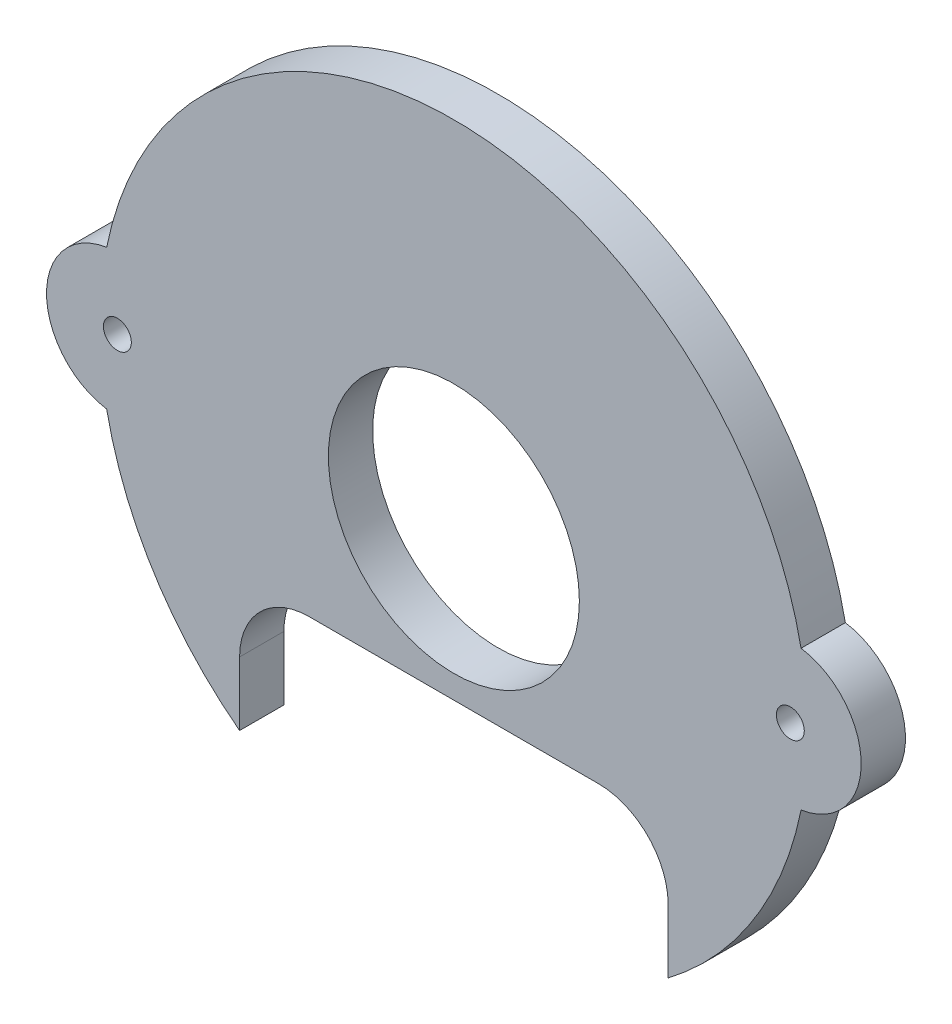
ISO-10303-21;
HEADER;
FILE_DESCRIPTION(('STEP AP214'),'2;1');
FILE_NAME('part.step','',(''),(''),'','','');
FILE_SCHEMA(('AUTOMOTIVE_DESIGN { 1 0 10303 214 1 1 1 1 }'));
ENDSEC;
DATA;
#1=APPLICATION_CONTEXT('core data for automotive mechanical design processes');
#2=APPLICATION_PROTOCOL_DEFINITION('international standard','automotive_design',2000,#1);
#3=PRODUCT_CONTEXT('',#1,'mechanical');
#4=PRODUCT('Part','Part','',(#3));
#5=PRODUCT_RELATED_PRODUCT_CATEGORY('part','',(#4));
#6=PRODUCT_DEFINITION_FORMATION('','',#4);
#7=PRODUCT_DEFINITION_CONTEXT('part definition',#1,'design');
#8=PRODUCT_DEFINITION('design','',#6,#7);
#9=PRODUCT_DEFINITION_SHAPE('','',#8);
#10=(LENGTH_UNIT() NAMED_UNIT(*) SI_UNIT(.MILLI.,.METRE.));
#11=(NAMED_UNIT(*) PLANE_ANGLE_UNIT() SI_UNIT($,.RADIAN.));
#12=(NAMED_UNIT(*) SI_UNIT($,.STERADIAN.) SOLID_ANGLE_UNIT());
#13=UNCERTAINTY_MEASURE_WITH_UNIT(LENGTH_MEASURE(1.E-05),#10,'distance_accuracy_value','');
#14=(GEOMETRIC_REPRESENTATION_CONTEXT(3) GLOBAL_UNCERTAINTY_ASSIGNED_CONTEXT((#13)) GLOBAL_UNIT_ASSIGNED_CONTEXT((#10,
#11,#12)) REPRESENTATION_CONTEXT('',''));
#15=CARTESIAN_POINT('',(0.,0.,0.));
#16=DIRECTION('',(0.,0.,1.));
#17=DIRECTION('',(1.,0.,0.));
#18=AXIS2_PLACEMENT_3D('',#15,#16,#17);
#19=CARTESIAN_POINT('',(12.065,0.,3.175));
#20=DIRECTION('',(0.,0.,1.));
#21=DIRECTION('',(1.,0.,0.));
#22=AXIS2_PLACEMENT_3D('',#19,#20,#21);
#23=PLANE('',#22);
#24=CARTESIAN_POINT('',(24.13,0.,3.175));
#25=DIRECTION('',(0.,0.,1.));
#26=DIRECTION('',(1.,0.,0.));
#27=AXIS2_PLACEMENT_3D('',#24,#25,#26);
#28=CIRCLE('',#27,1.);
#29=CARTESIAN_POINT('',(25.13,0.,3.175));
#30=VERTEX_POINT('',#29);
#31=EDGE_CURVE('E214',#30,#30,#28,.T.);
#32=ORIENTED_EDGE('',*,*,#31,.F.);
#33=EDGE_LOOP('',(#32));
#34=FACE_BOUND('',#33,.T.);
#35=CARTESIAN_POINT('',(-24.13,0.,3.175));
#36=DIRECTION('',(0.,0.,1.));
#37=DIRECTION('',(1.,0.,0.));
#38=AXIS2_PLACEMENT_3D('',#35,#36,#37);
#39=CIRCLE('',#38,1.);
#40=CARTESIAN_POINT('',(-23.13,0.,3.175));
#41=VERTEX_POINT('',#40);
#42=EDGE_CURVE('E143',#41,#41,#39,.T.);
#43=ORIENTED_EDGE('',*,*,#42,.F.);
#44=EDGE_LOOP('',(#43));
#45=FACE_BOUND('',#44,.T.);
#46=CARTESIAN_POINT('',(0.,0.,3.175));
#47=DIRECTION('',(0.,0.,1.));
#48=DIRECTION('',(1.,0.,0.));
#49=AXIS2_PLACEMENT_3D('',#46,#47,#48);
#50=CIRCLE('',#49,9.);
#51=CARTESIAN_POINT('',(9.,0.,3.175));
#52=VERTEX_POINT('',#51);
#53=EDGE_CURVE('E220',#52,#52,#50,.T.);
#54=ORIENTED_EDGE('',*,*,#53,.F.);
#55=EDGE_LOOP('',(#54));
#56=FACE_BOUND('',#55,.T.);
#57=DIRECTION('',(0.,1.,0.));
#58=VECTOR('',#57,1.);
#59=CARTESIAN_POINT('',(-15.367,0.,3.175));
#60=LINE('',#59,#58);
#61=CARTESIAN_POINT('',(-15.367,-20.2241269527265,3.175));
#62=VERTEX_POINT('',#61);
#63=CARTESIAN_POINT('',(-15.367,-15.6545488428575,3.175));
#64=VERTEX_POINT('',#63);
#65=EDGE_CURVE('E238',#62,#64,#60,.T.);
#66=ORIENTED_EDGE('',*,*,#65,.T.);
#67=CARTESIAN_POINT('',(-10.367,-15.6545488428575,3.175));
#68=DIRECTION('',(0.,0.,1.));
#69=DIRECTION('',(1.,0.,0.));
#70=AXIS2_PLACEMENT_3D('',#67,#68,#69);
#71=CIRCLE('',#70,5.);
#72=CARTESIAN_POINT('',(-10.367,-10.6545488428575,3.175));
#73=VERTEX_POINT('',#72);
#74=EDGE_CURVE('E11',#64,#73,#71,.F.);
#75=ORIENTED_EDGE('',*,*,#74,.T.);
#76=DIRECTION('',(1.,0.,0.));
#77=VECTOR('',#76,1.);
#78=CARTESIAN_POINT('',(12.065,-10.6545488428575,3.175));
#79=LINE('',#78,#77);
#80=CARTESIAN_POINT('',(10.367,-10.6545488428575,3.175));
#81=VERTEX_POINT('',#80);
#82=EDGE_CURVE('E228',#73,#81,#79,.T.);
#83=ORIENTED_EDGE('',*,*,#82,.T.);
#84=CARTESIAN_POINT('',(10.367,-15.6545488428575,3.175));
#85=DIRECTION('',(0.,0.,1.));
#86=DIRECTION('',(1.,0.,0.));
#87=AXIS2_PLACEMENT_3D('',#84,#85,#86);
#88=CIRCLE('',#87,5.);
#89=CARTESIAN_POINT('',(15.367,-15.6545488428575,3.175));
#90=VERTEX_POINT('',#89);
#91=EDGE_CURVE('E195',#81,#90,#88,.F.);
#92=ORIENTED_EDGE('',*,*,#91,.T.);
#93=DIRECTION('',(0.,-1.,0.));
#94=VECTOR('',#93,1.);
#95=CARTESIAN_POINT('',(15.367,0.,3.175));
#96=LINE('',#95,#94);
#97=CARTESIAN_POINT('',(15.367,-20.2241269527265,3.175));
#98=VERTEX_POINT('',#97);
#99=EDGE_CURVE('E235',#90,#98,#96,.T.);
#100=ORIENTED_EDGE('',*,*,#99,.T.);
#101=CARTESIAN_POINT('',(0.,0.,3.175));
#102=DIRECTION('',(0.,0.,1.));
#103=DIRECTION('',(1.,0.,0.));
#104=AXIS2_PLACEMENT_3D('',#101,#102,#103);
#105=CIRCLE('',#104,25.4);
#106=CARTESIAN_POINT('',(24.8986842105263,-5.02150620675586,3.175));
#107=VERTEX_POINT('',#106);
#108=EDGE_CURVE('E133',#98,#107,#105,.T.);
#109=ORIENTED_EDGE('',*,*,#108,.T.);
#110=CARTESIAN_POINT('',(24.13,0.,3.175));
#111=DIRECTION('',(0.,0.,1.));
#112=DIRECTION('',(1.,0.,0.));
#113=AXIS2_PLACEMENT_3D('',#110,#111,#112);
#114=CIRCLE('',#113,5.08000000000002);
#115=CARTESIAN_POINT('',(24.8986842105263,5.02150620675588,3.175));
#116=VERTEX_POINT('',#115);
#117=EDGE_CURVE('E202',#107,#116,#114,.T.);
#118=ORIENTED_EDGE('',*,*,#117,.T.);
#119=CARTESIAN_POINT('',(0.,0.,3.175));
#120=DIRECTION('',(0.,0.,1.));
#121=DIRECTION('',(1.,0.,0.));
#122=AXIS2_PLACEMENT_3D('',#119,#120,#121);
#123=CIRCLE('',#122,25.4);
#124=CARTESIAN_POINT('',(-24.8986842105263,5.02150620675583,3.175));
#125=VERTEX_POINT('',#124);
#126=EDGE_CURVE('E200',#116,#125,#123,.T.);
#127=ORIENTED_EDGE('',*,*,#126,.T.);
#128=CARTESIAN_POINT('',(-24.13,0.,3.175));
#129=DIRECTION('',(0.,0.,1.));
#130=DIRECTION('',(1.,0.,0.));
#131=AXIS2_PLACEMENT_3D('',#128,#129,#130);
#132=CIRCLE('',#131,5.08);
#133=CARTESIAN_POINT('',(-24.8986842105263,-5.02150620675586,3.175));
#134=VERTEX_POINT('',#133);
#135=EDGE_CURVE('E153',#125,#134,#132,.T.);
#136=ORIENTED_EDGE('',*,*,#135,.T.);
#137=EDGE_CURVE('E204',#134,#62,#105,.T.);
#138=ORIENTED_EDGE('',*,*,#137,.T.);
#139=EDGE_LOOP('',(#66,#75,#83,#92,#100,#109,#118,#127,#136,#138));
#140=FACE_BOUND('',#139,.T.);
#141=ADVANCED_FACE('F39',(#34,#45,#56,#140),#23,.T.);
#142=CARTESIAN_POINT('',(12.065,0.,0.));
#143=DIRECTION('',(0.,0.,1.));
#144=DIRECTION('',(1.,0.,0.));
#145=AXIS2_PLACEMENT_3D('',#142,#143,#144);
#146=PLANE('',#145);
#147=CARTESIAN_POINT('',(0.,0.,0.));
#148=DIRECTION('',(0.,0.,1.));
#149=DIRECTION('',(1.,0.,0.));
#150=AXIS2_PLACEMENT_3D('',#147,#148,#149);
#151=CIRCLE('',#150,9.);
#152=CARTESIAN_POINT('',(9.,0.,0.));
#153=VERTEX_POINT('',#152);
#154=EDGE_CURVE('E224',#153,#153,#151,.T.);
#155=ORIENTED_EDGE('',*,*,#154,.T.);
#156=EDGE_LOOP('',(#155));
#157=FACE_BOUND('',#156,.T.);
#158=CARTESIAN_POINT('',(24.13,0.,0.));
#159=DIRECTION('',(0.,0.,1.));
#160=DIRECTION('',(1.,0.,0.));
#161=AXIS2_PLACEMENT_3D('',#158,#159,#160);
#162=CIRCLE('',#161,1.);
#163=CARTESIAN_POINT('',(25.13,0.,0.));
#164=VERTEX_POINT('',#163);
#165=EDGE_CURVE('E216',#164,#164,#162,.T.);
#166=ORIENTED_EDGE('',*,*,#165,.T.);
#167=EDGE_LOOP('',(#166));
#168=FACE_BOUND('',#167,.T.);
#169=CARTESIAN_POINT('',(-24.13,0.,0.));
#170=DIRECTION('',(0.,0.,1.));
#171=DIRECTION('',(1.,0.,0.));
#172=AXIS2_PLACEMENT_3D('',#169,#170,#171);
#173=CIRCLE('',#172,1.);
#174=CARTESIAN_POINT('',(-23.13,0.,0.));
#175=VERTEX_POINT('',#174);
#176=EDGE_CURVE('E149',#175,#175,#173,.T.);
#177=ORIENTED_EDGE('',*,*,#176,.T.);
#178=EDGE_LOOP('',(#177));
#179=FACE_BOUND('',#178,.T.);
#180=DIRECTION('',(0.,1.,0.));
#181=VECTOR('',#180,1.);
#182=CARTESIAN_POINT('',(15.367,-10.6545488428575,0.));
#183=LINE('',#182,#181);
#184=CARTESIAN_POINT('',(15.367,-20.2241269527265,0.));
#185=VERTEX_POINT('',#184);
#186=CARTESIAN_POINT('',(15.367,-15.6545488428575,0.));
#187=VERTEX_POINT('',#186);
#188=EDGE_CURVE('E116',#185,#187,#183,.T.);
#189=ORIENTED_EDGE('',*,*,#188,.T.);
#190=CARTESIAN_POINT('',(10.367,-15.6545488428575,0.));
#191=DIRECTION('',(0.,0.,1.));
#192=DIRECTION('',(1.,0.,0.));
#193=AXIS2_PLACEMENT_3D('',#190,#191,#192);
#194=CIRCLE('',#193,5.);
#195=CARTESIAN_POINT('',(10.367,-10.6545488428575,0.));
#196=VERTEX_POINT('',#195);
#197=EDGE_CURVE('E192',#187,#196,#194,.T.);
#198=ORIENTED_EDGE('',*,*,#197,.T.);
#199=DIRECTION('',(-1.,0.,0.));
#200=VECTOR('',#199,1.);
#201=CARTESIAN_POINT('',(-15.367,-10.6545488428575,0.));
#202=LINE('',#201,#200);
#203=CARTESIAN_POINT('',(-10.367,-10.6545488428575,0.));
#204=VERTEX_POINT('',#203);
#205=EDGE_CURVE('E126',#196,#204,#202,.T.);
#206=ORIENTED_EDGE('',*,*,#205,.T.);
#207=CARTESIAN_POINT('',(-10.367,-15.6545488428575,0.));
#208=DIRECTION('',(0.,0.,1.));
#209=DIRECTION('',(1.,0.,0.));
#210=AXIS2_PLACEMENT_3D('',#207,#208,#209);
#211=CIRCLE('',#210,5.);
#212=CARTESIAN_POINT('',(-15.367,-15.6545488428575,0.));
#213=VERTEX_POINT('',#212);
#214=EDGE_CURVE('E48',#204,#213,#211,.T.);
#215=ORIENTED_EDGE('',*,*,#214,.T.);
#216=DIRECTION('',(0.,-1.,0.));
#217=VECTOR('',#216,1.);
#218=CARTESIAN_POINT('',(-15.367,-20.2241269527265,0.));
#219=LINE('',#218,#217);
#220=CARTESIAN_POINT('',(-15.367,-20.2241269527265,0.));
#221=VERTEX_POINT('',#220);
#222=EDGE_CURVE('E241',#213,#221,#219,.T.);
#223=ORIENTED_EDGE('',*,*,#222,.T.);
#224=CARTESIAN_POINT('',(0.,0.,0.));
#225=DIRECTION('',(0.,0.,1.));
#226=DIRECTION('',(1.,0.,0.));
#227=AXIS2_PLACEMENT_3D('',#224,#225,#226);
#228=CIRCLE('',#227,25.4);
#229=CARTESIAN_POINT('',(-24.8986842105263,-5.02150620675586,0.));
#230=VERTEX_POINT('',#229);
#231=EDGE_CURVE('E142',#230,#221,#228,.T.);
#232=ORIENTED_EDGE('',*,*,#231,.F.);
#233=CARTESIAN_POINT('',(-24.13,0.,0.));
#234=DIRECTION('',(0.,0.,1.));
#235=DIRECTION('',(1.,0.,0.));
#236=AXIS2_PLACEMENT_3D('',#233,#234,#235);
#237=CIRCLE('',#236,5.08);
#238=CARTESIAN_POINT('',(-24.8986842105263,5.02150620675583,0.));
#239=VERTEX_POINT('',#238);
#240=EDGE_CURVE('E160',#239,#230,#237,.T.);
#241=ORIENTED_EDGE('',*,*,#240,.F.);
#242=CARTESIAN_POINT('',(0.,0.,0.));
#243=DIRECTION('',(0.,0.,1.));
#244=DIRECTION('',(1.,0.,0.));
#245=AXIS2_PLACEMENT_3D('',#242,#243,#244);
#246=CIRCLE('',#245,25.4);
#247=CARTESIAN_POINT('',(24.8986842105263,5.02150620675588,0.));
#248=VERTEX_POINT('',#247);
#249=EDGE_CURVE('E157',#248,#239,#246,.T.);
#250=ORIENTED_EDGE('',*,*,#249,.F.);
#251=CARTESIAN_POINT('',(24.13,0.,0.));
#252=DIRECTION('',(0.,0.,1.));
#253=DIRECTION('',(1.,0.,0.));
#254=AXIS2_PLACEMENT_3D('',#251,#252,#253);
#255=CIRCLE('',#254,5.08000000000002);
#256=CARTESIAN_POINT('',(24.8986842105263,-5.02150620675586,0.));
#257=VERTEX_POINT('',#256);
#258=EDGE_CURVE('E139',#257,#248,#255,.T.);
#259=ORIENTED_EDGE('',*,*,#258,.F.);
#260=EDGE_CURVE('E131',#185,#257,#228,.T.);
#261=ORIENTED_EDGE('',*,*,#260,.F.);
#262=EDGE_LOOP('',(#189,#198,#206,#215,#223,#232,#241,#250,#259,#261));
#263=FACE_BOUND('',#262,.T.);
#264=ADVANCED_FACE('F137',(#157,#168,#179,#263),#146,.F.);
#265=CARTESIAN_POINT('',(0.,0.,3.175));
#266=DIRECTION('',(0.,0.,-1.));
#267=DIRECTION('',(-1.,0.,0.));
#268=AXIS2_PLACEMENT_3D('',#265,#266,#267);
#269=CYLINDRICAL_SURFACE('',#268,25.4);
#270=DIRECTION('',(0.,0.,-1.));
#271=VECTOR('',#270,1.);
#272=CARTESIAN_POINT('',(15.367,-20.2241269527265,3.175));
#273=LINE('',#272,#271);
#274=EDGE_CURVE('E120',#185,#98,#273,.F.);
#275=ORIENTED_EDGE('',*,*,#274,.F.);
#276=ORIENTED_EDGE('',*,*,#260,.T.);
#277=DIRECTION('',(0.,0.,-1.));
#278=VECTOR('',#277,1.);
#279=CARTESIAN_POINT('',(24.8986842105263,-5.02150620675586,3.175));
#280=LINE('',#279,#278);
#281=EDGE_CURVE('E175',#107,#257,#280,.T.);
#282=ORIENTED_EDGE('',*,*,#281,.F.);
#283=ORIENTED_EDGE('',*,*,#108,.F.);
#284=EDGE_LOOP('',(#275,#276,#282,#283));
#285=FACE_BOUND('',#284,.T.);
#286=ADVANCED_FACE('F129',(#285),#269,.T.);
#287=DIRECTION('',(0.,0.,-1.));
#288=VECTOR('',#287,1.);
#289=CARTESIAN_POINT('',(-15.367,-20.2241269527265,3.175));
#290=LINE('',#289,#288);
#291=EDGE_CURVE('E135',#62,#221,#290,.T.);
#292=ORIENTED_EDGE('',*,*,#291,.F.);
#293=ORIENTED_EDGE('',*,*,#137,.F.);
#294=DIRECTION('',(0.,0.,-1.));
#295=VECTOR('',#294,1.);
#296=CARTESIAN_POINT('',(-24.8986842105263,-5.02150620675586,3.175));
#297=LINE('',#296,#295);
#298=EDGE_CURVE('E163',#134,#230,#297,.T.);
#299=ORIENTED_EDGE('',*,*,#298,.T.);
#300=ORIENTED_EDGE('',*,*,#231,.T.);
#301=EDGE_LOOP('',(#292,#293,#299,#300));
#302=FACE_BOUND('',#301,.T.);
#303=ADVANCED_FACE('F286',(#302),#269,.T.);
#304=CARTESIAN_POINT('',(24.13,0.,3.175));
#305=DIRECTION('',(0.,0.,-1.));
#306=DIRECTION('',(-1.,0.,0.));
#307=AXIS2_PLACEMENT_3D('',#304,#305,#306);
#308=CYLINDRICAL_SURFACE('',#307,5.08000000000002);
#309=ORIENTED_EDGE('',*,*,#258,.T.);
#310=DIRECTION('',(0.,0.,-1.));
#311=VECTOR('',#310,1.);
#312=CARTESIAN_POINT('',(24.8986842105263,5.02150620675588,3.175));
#313=LINE('',#312,#311);
#314=EDGE_CURVE('E171',#116,#248,#313,.T.);
#315=ORIENTED_EDGE('',*,*,#314,.F.);
#316=ORIENTED_EDGE('',*,*,#117,.F.);
#317=ORIENTED_EDGE('',*,*,#281,.T.);
#318=EDGE_LOOP('',(#309,#315,#316,#317));
#319=FACE_BOUND('',#318,.T.);
#320=ADVANCED_FACE('F282',(#319),#308,.T.);
#321=CARTESIAN_POINT('',(0.,0.,3.175));
#322=DIRECTION('',(0.,0.,-1.));
#323=DIRECTION('',(-1.,0.,0.));
#324=AXIS2_PLACEMENT_3D('',#321,#322,#323);
#325=CYLINDRICAL_SURFACE('',#324,25.4);
#326=ORIENTED_EDGE('',*,*,#249,.T.);
#327=DIRECTION('',(0.,0.,-1.));
#328=VECTOR('',#327,1.);
#329=CARTESIAN_POINT('',(-24.8986842105263,5.02150620675583,3.175));
#330=LINE('',#329,#328);
#331=EDGE_CURVE('E167',#125,#239,#330,.T.);
#332=ORIENTED_EDGE('',*,*,#331,.F.);
#333=ORIENTED_EDGE('',*,*,#126,.F.);
#334=ORIENTED_EDGE('',*,*,#314,.T.);
#335=EDGE_LOOP('',(#326,#332,#333,#334));
#336=FACE_BOUND('',#335,.T.);
#337=ADVANCED_FACE('F278',(#336),#325,.T.);
#338=CARTESIAN_POINT('',(-24.13,0.,3.175));
#339=DIRECTION('',(0.,0.,-1.));
#340=DIRECTION('',(-1.,0.,0.));
#341=AXIS2_PLACEMENT_3D('',#338,#339,#340);
#342=CYLINDRICAL_SURFACE('',#341,5.08);
#343=ORIENTED_EDGE('',*,*,#240,.T.);
#344=ORIENTED_EDGE('',*,*,#298,.F.);
#345=ORIENTED_EDGE('',*,*,#135,.F.);
#346=ORIENTED_EDGE('',*,*,#331,.T.);
#347=EDGE_LOOP('',(#343,#344,#345,#346));
#348=FACE_BOUND('',#347,.T.);
#349=ADVANCED_FACE('F275',(#348),#342,.T.);
#350=CARTESIAN_POINT('',(-24.13,0.,3.175));
#351=DIRECTION('',(0.,0.,-1.));
#352=DIRECTION('',(-1.,0.,0.));
#353=AXIS2_PLACEMENT_3D('',#350,#351,#352);
#354=CYLINDRICAL_SURFACE('',#353,1.);
#355=ORIENTED_EDGE('',*,*,#42,.T.);
#356=EDGE_LOOP('',(#355));
#357=FACE_BOUND('',#356,.T.);
#358=ORIENTED_EDGE('',*,*,#176,.F.);
#359=EDGE_LOOP('',(#358));
#360=FACE_BOUND('',#359,.T.);
#361=ADVANCED_FACE('F272',(#357,#360),#354,.F.);
#362=CARTESIAN_POINT('',(24.13,0.,3.175));
#363=DIRECTION('',(0.,0.,-1.));
#364=DIRECTION('',(-1.,0.,0.));
#365=AXIS2_PLACEMENT_3D('',#362,#363,#364);
#366=CYLINDRICAL_SURFACE('',#365,1.);
#367=ORIENTED_EDGE('',*,*,#31,.T.);
#368=EDGE_LOOP('',(#367));
#369=FACE_BOUND('',#368,.T.);
#370=ORIENTED_EDGE('',*,*,#165,.F.);
#371=EDGE_LOOP('',(#370));
#372=FACE_BOUND('',#371,.T.);
#373=ADVANCED_FACE('F314',(#369,#372),#366,.F.);
#374=CARTESIAN_POINT('',(0.,0.,3.175));
#375=DIRECTION('',(0.,0.,-1.));
#376=DIRECTION('',(-1.,0.,0.));
#377=AXIS2_PLACEMENT_3D('',#374,#375,#376);
#378=CYLINDRICAL_SURFACE('',#377,9.);
#379=ORIENTED_EDGE('',*,*,#53,.T.);
#380=EDGE_LOOP('',(#379));
#381=FACE_BOUND('',#380,.T.);
#382=ORIENTED_EDGE('',*,*,#154,.F.);
#383=EDGE_LOOP('',(#382));
#384=FACE_BOUND('',#383,.T.);
#385=ADVANCED_FACE('F312',(#381,#384),#378,.F.);
#386=CARTESIAN_POINT('',(15.367,-10.6545488428575,9.398));
#387=DIRECTION('',(-1.,0.,0.));
#388=DIRECTION('',(0.,0.,1.));
#389=AXIS2_PLACEMENT_3D('',#386,#387,#388);
#390=PLANE('',#389);
#391=ORIENTED_EDGE('',*,*,#99,.F.);
#392=DIRECTION('',(0.,0.,-1.));
#393=VECTOR('',#392,1.);
#394=CARTESIAN_POINT('',(15.367,-15.6545488428575,0.));
#395=LINE('',#394,#393);
#396=EDGE_CURVE('E123',#90,#187,#395,.T.);
#397=ORIENTED_EDGE('',*,*,#396,.T.);
#398=ORIENTED_EDGE('',*,*,#188,.F.);
#399=ORIENTED_EDGE('',*,*,#274,.T.);
#400=EDGE_LOOP('',(#391,#397,#398,#399));
#401=FACE_BOUND('',#400,.T.);
#402=ADVANCED_FACE('F119',(#401),#390,.T.);
#403=CARTESIAN_POINT('',(-15.367,-10.6545488428575,9.398));
#404=DIRECTION('',(0.,-1.,0.));
#405=DIRECTION('',(0.,0.,-1.));
#406=AXIS2_PLACEMENT_3D('',#403,#404,#405);
#407=PLANE('',#406);
#408=ORIENTED_EDGE('',*,*,#205,.F.);
#409=DIRECTION('',(0.,0.,-1.));
#410=VECTOR('',#409,1.);
#411=CARTESIAN_POINT('',(10.367,-10.6545488428575,3.175));
#412=LINE('',#411,#410);
#413=EDGE_CURVE('E187',#196,#81,#412,.F.);
#414=ORIENTED_EDGE('',*,*,#413,.T.);
#415=ORIENTED_EDGE('',*,*,#82,.F.);
#416=DIRECTION('',(0.,0.,-1.));
#417=VECTOR('',#416,1.);
#418=CARTESIAN_POINT('',(-10.367,-10.6545488428575,0.));
#419=LINE('',#418,#417);
#420=EDGE_CURVE('E183',#73,#204,#419,.T.);
#421=ORIENTED_EDGE('',*,*,#420,.T.);
#422=EDGE_LOOP('',(#408,#414,#415,#421));
#423=FACE_BOUND('',#422,.T.);
#424=ADVANCED_FACE('F248',(#423),#407,.T.);
#425=CARTESIAN_POINT('',(-15.367,-20.2241269527265,9.398));
#426=DIRECTION('',(1.,0.,0.));
#427=DIRECTION('',(0.,0.,-1.));
#428=AXIS2_PLACEMENT_3D('',#425,#426,#427);
#429=PLANE('',#428);
#430=ORIENTED_EDGE('',*,*,#222,.F.);
#431=DIRECTION('',(0.,0.,-1.));
#432=VECTOR('',#431,1.);
#433=CARTESIAN_POINT('',(-15.367,-15.6545488428575,3.175));
#434=LINE('',#433,#432);
#435=EDGE_CURVE('E55',#213,#64,#434,.F.);
#436=ORIENTED_EDGE('',*,*,#435,.T.);
#437=ORIENTED_EDGE('',*,*,#65,.F.);
#438=ORIENTED_EDGE('',*,*,#291,.T.);
#439=EDGE_LOOP('',(#430,#436,#437,#438));
#440=FACE_BOUND('',#439,.T.);
#441=ADVANCED_FACE('F260',(#440),#429,.T.);
#442=CARTESIAN_POINT('',(10.367,-15.6545488428575,9.398));
#443=DIRECTION('',(0.,0.,1.));
#444=DIRECTION('',(1.,0.,0.));
#445=AXIS2_PLACEMENT_3D('',#442,#443,#444);
#446=CYLINDRICAL_SURFACE('',#445,5.);
#447=ORIENTED_EDGE('',*,*,#91,.F.);
#448=ORIENTED_EDGE('',*,*,#413,.F.);
#449=ORIENTED_EDGE('',*,*,#197,.F.);
#450=ORIENTED_EDGE('',*,*,#396,.F.);
#451=EDGE_LOOP('',(#447,#448,#449,#450));
#452=FACE_BOUND('',#451,.T.);
#453=ADVANCED_FACE('F253',(#452),#446,.F.);
#454=CARTESIAN_POINT('',(-10.367,-15.6545488428575,9.398));
#455=DIRECTION('',(0.,0.,1.));
#456=DIRECTION('',(1.,0.,0.));
#457=AXIS2_PLACEMENT_3D('',#454,#455,#456);
#458=CYLINDRICAL_SURFACE('',#457,5.);
#459=ORIENTED_EDGE('',*,*,#74,.F.);
#460=ORIENTED_EDGE('',*,*,#435,.F.);
#461=ORIENTED_EDGE('',*,*,#214,.F.);
#462=ORIENTED_EDGE('',*,*,#420,.F.);
#463=EDGE_LOOP('',(#459,#460,#461,#462));
#464=FACE_BOUND('',#463,.T.);
#465=ADVANCED_FACE('F41',(#464),#458,.F.);
#466=CLOSED_SHELL('',(#141,#264,#286,#303,#320,#337,#349,#361,#373,#385,#402,#424,#441,#453,#465));
#467=MANIFOLD_SOLID_BREP('B2',#466);
#468=ADVANCED_BREP_SHAPE_REPRESENTATION('',(#18,#467),#14);
#469=SHAPE_DEFINITION_REPRESENTATION(#9,#468);
ENDSEC;
END-ISO-10303-21;
